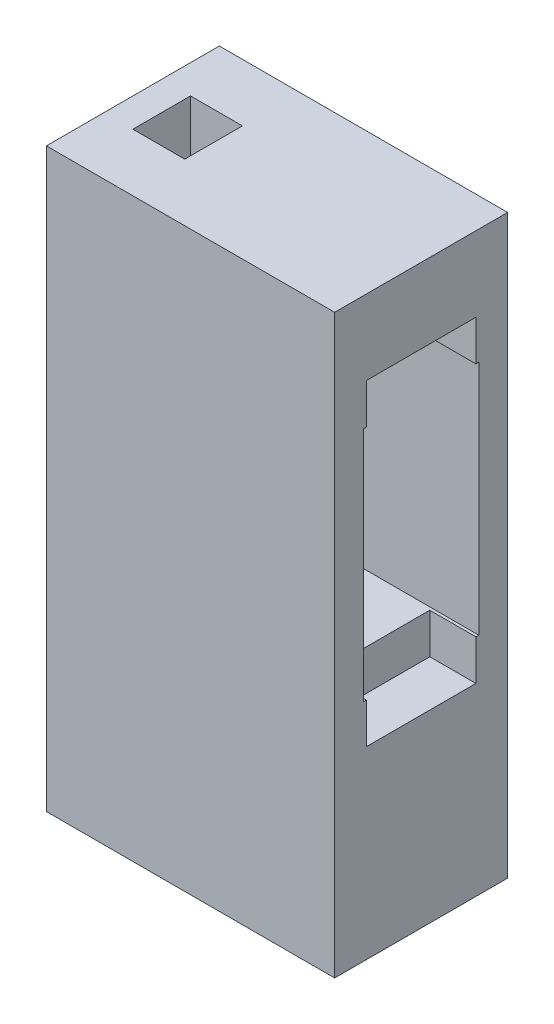
ISO-10303-21;
HEADER;
FILE_DESCRIPTION(('STEP AP214'),'2;1');
FILE_NAME('part.step','',(''),(''),'','','');
FILE_SCHEMA(('AUTOMOTIVE_DESIGN { 1 0 10303 214 1 1 1 1 }'));
ENDSEC;
DATA;
#1=APPLICATION_CONTEXT('core data for automotive mechanical design processes');
#2=APPLICATION_PROTOCOL_DEFINITION('international standard','automotive_design',2000,#1);
#3=PRODUCT_CONTEXT('',#1,'mechanical');
#4=PRODUCT('Part','Part','',(#3));
#5=PRODUCT_RELATED_PRODUCT_CATEGORY('part','',(#4));
#6=PRODUCT_DEFINITION_FORMATION('','',#4);
#7=PRODUCT_DEFINITION_CONTEXT('part definition',#1,'design');
#8=PRODUCT_DEFINITION('design','',#6,#7);
#9=PRODUCT_DEFINITION_SHAPE('','',#8);
#10=(LENGTH_UNIT() NAMED_UNIT(*) SI_UNIT(.MILLI.,.METRE.));
#11=(NAMED_UNIT(*) PLANE_ANGLE_UNIT() SI_UNIT($,.RADIAN.));
#12=(NAMED_UNIT(*) SI_UNIT($,.STERADIAN.) SOLID_ANGLE_UNIT());
#13=UNCERTAINTY_MEASURE_WITH_UNIT(LENGTH_MEASURE(1.E-05),#10,'distance_accuracy_value','');
#14=(GEOMETRIC_REPRESENTATION_CONTEXT(3) GLOBAL_UNCERTAINTY_ASSIGNED_CONTEXT((#13)) GLOBAL_UNIT_ASSIGNED_CONTEXT((#10,
#11,#12)) REPRESENTATION_CONTEXT('',''));
#15=CARTESIAN_POINT('',(0.,0.,0.));
#16=DIRECTION('',(0.,0.,1.));
#17=DIRECTION('',(1.,0.,0.));
#18=AXIS2_PLACEMENT_3D('',#15,#16,#17);
#19=CARTESIAN_POINT('',(-3.99999999999996,0.,0.));
#20=DIRECTION('',(1.,0.,0.));
#21=DIRECTION('',(0.,0.,-1.));
#22=AXIS2_PLACEMENT_3D('',#19,#20,#21);
#23=PLANE('',#22);
#24=DIRECTION('',(0.,1.,0.));
#25=VECTOR('',#24,1.);
#26=CARTESIAN_POINT('',(-3.99999999999996,0.,-7.99999999999999));
#27=LINE('',#26,#25);
#28=CARTESIAN_POINT('',(-3.99999999999996,39.,-7.99999999999999));
#29=VERTEX_POINT('',#28);
#30=CARTESIAN_POINT('',(-3.99999999999996,80.,-7.99999999999999));
#31=VERTEX_POINT('',#30);
#32=EDGE_CURVE('E504',#29,#31,#27,.T.);
#33=ORIENTED_EDGE('',*,*,#32,.F.);
#34=DIRECTION('',(0.,0.,-1.));
#35=VECTOR('',#34,1.);
#36=CARTESIAN_POINT('',(-3.99999999999996,39.,7.));
#37=LINE('',#36,#35);
#38=CARTESIAN_POINT('',(-3.99999999999997,39.,-13.));
#39=VERTEX_POINT('',#38);
#40=EDGE_CURVE('E412',#29,#39,#37,.T.);
#41=ORIENTED_EDGE('',*,*,#40,.T.);
#42=DIRECTION('',(0.,1.,0.));
#43=VECTOR('',#42,1.);
#44=CARTESIAN_POINT('',(-3.99999999999997,80.,-13.));
#45=LINE('',#44,#43);
#46=CARTESIAN_POINT('',(-3.99999999999997,80.,-13.));
#47=VERTEX_POINT('',#46);
#48=EDGE_CURVE('E417',#39,#47,#45,.T.);
#49=ORIENTED_EDGE('',*,*,#48,.T.);
#50=DIRECTION('',(0.,0.,1.));
#51=VECTOR('',#50,1.);
#52=CARTESIAN_POINT('',(-3.99999999999996,80.,7.));
#53=LINE('',#52,#51);
#54=EDGE_CURVE('E422',#47,#31,#53,.T.);
#55=ORIENTED_EDGE('',*,*,#54,.T.);
#56=EDGE_LOOP('',(#33,#41,#49,#55));
#57=FACE_BOUND('',#56,.T.);
#58=ADVANCED_FACE('F38',(#57),#23,.T.);
#59=CARTESIAN_POINT('',(-3.99999999999996,80.,7.));
#60=DIRECTION('',(0.,1.,0.));
#61=DIRECTION('',(0.,0.,1.));
#62=AXIS2_PLACEMENT_3D('',#59,#60,#61);
#63=PLANE('',#62);
#64=DIRECTION('',(1.,0.,0.));
#65=VECTOR('',#64,1.);
#66=CARTESIAN_POINT('',(-3.99999999999996,80.,2.00000000000001));
#67=LINE('',#66,#65);
#68=CARTESIAN_POINT('',(-3.99999999999996,80.,2.00000000000001));
#69=VERTEX_POINT('',#68);
#70=CARTESIAN_POINT('',(-2.99999999999998,80.,2.00000000000001));
#71=VERTEX_POINT('',#70);
#72=EDGE_CURVE('E299',#69,#71,#67,.T.);
#73=ORIENTED_EDGE('',*,*,#72,.T.);
#74=DIRECTION('',(0.,0.,-1.));
#75=VECTOR('',#74,1.);
#76=CARTESIAN_POINT('',(-2.99999999999998,80.,7.));
#77=LINE('',#76,#75);
#78=CARTESIAN_POINT('',(-2.99999999999998,80.,0.500000000000022));
#79=VERTEX_POINT('',#78);
#80=EDGE_CURVE('E295',#71,#79,#77,.T.);
#81=ORIENTED_EDGE('',*,*,#80,.T.);
#82=DIRECTION('',(1.,0.,0.));
#83=VECTOR('',#82,1.);
#84=CARTESIAN_POINT('',(-3.99999999999997,80.,0.500000000000022));
#85=LINE('',#84,#83);
#86=CARTESIAN_POINT('',(25.,80.,0.500000000000011));
#87=VERTEX_POINT('',#86);
#88=EDGE_CURVE('E315',#79,#87,#85,.T.);
#89=ORIENTED_EDGE('',*,*,#88,.T.);
#90=DIRECTION('',(0.,0.,-1.));
#91=VECTOR('',#90,1.);
#92=CARTESIAN_POINT('',(25.,80.,6.50000000000001));
#93=LINE('',#92,#91);
#94=CARTESIAN_POINT('',(25.,80.,6.50000000000001));
#95=VERTEX_POINT('',#94);
#96=EDGE_CURVE('E333',#95,#87,#93,.T.);
#97=ORIENTED_EDGE('',*,*,#96,.F.);
#98=DIRECTION('',(1.,0.,0.));
#99=VECTOR('',#98,1.);
#100=CARTESIAN_POINT('',(25.,80.,6.50000000000001));
#101=LINE('',#100,#99);
#102=CARTESIAN_POINT('',(33.,80.,6.50000000000001));
#103=VERTEX_POINT('',#102);
#104=EDGE_CURVE('E346',#95,#103,#101,.T.);
#105=ORIENTED_EDGE('',*,*,#104,.T.);
#106=DIRECTION('',(0.,0.,1.));
#107=VECTOR('',#106,1.);
#108=CARTESIAN_POINT('',(33.,80.,6.99999999999998));
#109=LINE('',#108,#107);
#110=CARTESIAN_POINT('',(33.,80.,6.99999999999998));
#111=VERTEX_POINT('',#110);
#112=EDGE_CURVE('E438',#103,#111,#109,.T.);
#113=ORIENTED_EDGE('',*,*,#112,.T.);
#114=DIRECTION('',(1.,0.,0.));
#115=VECTOR('',#114,1.);
#116=CARTESIAN_POINT('',(-3.99999999999996,80.,7.));
#117=LINE('',#116,#115);
#118=CARTESIAN_POINT('',(-3.99999999999996,80.,7.));
#119=VERTEX_POINT('',#118);
#120=EDGE_CURVE('E442',#119,#111,#117,.T.);
#121=ORIENTED_EDGE('',*,*,#120,.F.);
#122=EDGE_CURVE('E421',#69,#119,#53,.T.);
#123=ORIENTED_EDGE('',*,*,#122,.F.);
#124=EDGE_LOOP('',(#73,#81,#89,#97,#105,#113,#121,#123));
#125=FACE_BOUND('',#124,.T.);
#126=ADVANCED_FACE('F530',(#125),#63,.F.);
#127=CARTESIAN_POINT('',(25.,0.,0.));
#128=DIRECTION('',(-1.,0.,0.));
#129=DIRECTION('',(0.,0.,1.));
#130=AXIS2_PLACEMENT_3D('',#127,#128,#129);
#131=PLANE('',#130);
#132=ORIENTED_EDGE('',*,*,#96,.T.);
#133=DIRECTION('',(0.,-1.,0.));
#134=VECTOR('',#133,1.);
#135=CARTESIAN_POINT('',(25.,80.,0.500000000000011));
#136=LINE('',#135,#134);
#137=CARTESIAN_POINT('',(25.,87.,0.500000000000011));
#138=VERTEX_POINT('',#137);
#139=EDGE_CURVE('E307',#138,#87,#136,.T.);
#140=ORIENTED_EDGE('',*,*,#139,.F.);
#141=DIRECTION('',(0.,0.,1.));
#142=VECTOR('',#141,1.);
#143=CARTESIAN_POINT('',(25.,87.,6.50000000000001));
#144=LINE('',#143,#142);
#145=CARTESIAN_POINT('',(25.,87.,6.50000000000001));
#146=VERTEX_POINT('',#145);
#147=EDGE_CURVE('E341',#138,#146,#144,.T.);
#148=ORIENTED_EDGE('',*,*,#147,.T.);
#149=DIRECTION('',(0.,-1.,0.));
#150=VECTOR('',#149,1.);
#151=CARTESIAN_POINT('',(25.,80.,6.50000000000001));
#152=LINE('',#151,#150);
#153=EDGE_CURVE('E328',#146,#95,#152,.T.);
#154=ORIENTED_EDGE('',*,*,#153,.T.);
#155=EDGE_LOOP('',(#132,#140,#148,#154));
#156=FACE_BOUND('',#155,.T.);
#157=ADVANCED_FACE('F539',(#156),#131,.F.);
#158=CARTESIAN_POINT('',(-17.,100.,-18.));
#159=DIRECTION('',(1.,0.,0.));
#160=DIRECTION('',(0.,0.,-1.));
#161=AXIS2_PLACEMENT_3D('',#158,#159,#160);
#162=PLANE('',#161);
#163=CARTESIAN_POINT('',(-17.,71.,-2.03845671726555));
#164=DIRECTION('',(-1.,0.,0.));
#165=DIRECTION('',(0.,0.,1.));
#166=AXIS2_PLACEMENT_3D('',#163,#164,#165);
#167=CIRCLE('',#166,3.);
#168=CARTESIAN_POINT('',(-17.,71.,0.961543282734456));
#169=VERTEX_POINT('',#168);
#170=EDGE_CURVE('E654',#169,#169,#167,.T.);
#171=ORIENTED_EDGE('',*,*,#170,.F.);
#172=EDGE_LOOP('',(#171));
#173=FACE_BOUND('',#172,.T.);
#174=DIRECTION('',(0.,0.,1.));
#175=VECTOR('',#174,1.);
#176=CARTESIAN_POINT('',(-17.,39.,-7.99999999999999));
#177=LINE('',#176,#175);
#178=CARTESIAN_POINT('',(-17.,39.,-7.99999999999999));
#179=VERTEX_POINT('',#178);
#180=CARTESIAN_POINT('',(-17.,39.,2.00000000000001));
#181=VERTEX_POINT('',#180);
#182=EDGE_CURVE('E236',#179,#181,#177,.T.);
#183=ORIENTED_EDGE('',*,*,#182,.F.);
#184=DIRECTION('',(0.,-1.,0.));
#185=VECTOR('',#184,1.);
#186=CARTESIAN_POINT('',(-17.,39.,-7.99999999999999));
#187=LINE('',#186,#185);
#188=CARTESIAN_POINT('',(-17.,49.,-7.99999999999999));
#189=VERTEX_POINT('',#188);
#190=EDGE_CURVE('E243',#189,#179,#187,.T.);
#191=ORIENTED_EDGE('',*,*,#190,.F.);
#192=DIRECTION('',(0.,0.,-1.));
#193=VECTOR('',#192,1.);
#194=CARTESIAN_POINT('',(-17.,49.,-7.99999999999999));
#195=LINE('',#194,#193);
#196=CARTESIAN_POINT('',(-17.,49.,2.00000000000001));
#197=VERTEX_POINT('',#196);
#198=EDGE_CURVE('E247',#197,#189,#195,.T.);
#199=ORIENTED_EDGE('',*,*,#198,.F.);
#200=DIRECTION('',(0.,1.,0.));
#201=VECTOR('',#200,1.);
#202=CARTESIAN_POINT('',(-17.,39.,2.00000000000001));
#203=LINE('',#202,#201);
#204=EDGE_CURVE('E224',#181,#197,#203,.T.);
#205=ORIENTED_EDGE('',*,*,#204,.F.);
#206=EDGE_LOOP('',(#183,#191,#199,#205));
#207=FACE_BOUND('',#206,.T.);
#208=DIRECTION('',(0.,0.,1.));
#209=VECTOR('',#208,1.);
#210=CARTESIAN_POINT('',(-17.,0.,-18.));
#211=LINE('',#210,#209);
#212=CARTESIAN_POINT('',(-17.,0.,-18.));
#213=VERTEX_POINT('',#212);
#214=CARTESIAN_POINT('',(-17.,0.,12.));
#215=VERTEX_POINT('',#214);
#216=EDGE_CURVE('E446',#213,#215,#211,.T.);
#217=ORIENTED_EDGE('',*,*,#216,.T.);
#218=DIRECTION('',(0.,-1.,0.));
#219=VECTOR('',#218,1.);
#220=CARTESIAN_POINT('',(-17.,100.,12.));
#221=LINE('',#220,#219);
#222=CARTESIAN_POINT('',(-17.,100.,12.));
#223=VERTEX_POINT('',#222);
#224=EDGE_CURVE('E494',#223,#215,#221,.T.);
#225=ORIENTED_EDGE('',*,*,#224,.F.);
#226=DIRECTION('',(0.,0.,1.));
#227=VECTOR('',#226,1.);
#228=CARTESIAN_POINT('',(-17.,100.,-18.));
#229=LINE('',#228,#227);
#230=CARTESIAN_POINT('',(-17.,100.,-18.));
#231=VERTEX_POINT('',#230);
#232=EDGE_CURVE('E457',#231,#223,#229,.T.);
#233=ORIENTED_EDGE('',*,*,#232,.F.);
#234=DIRECTION('',(0.,-1.,0.));
#235=VECTOR('',#234,1.);
#236=CARTESIAN_POINT('',(-17.,100.,-18.));
#237=LINE('',#236,#235);
#238=EDGE_CURVE('E471',#231,#213,#237,.T.);
#239=ORIENTED_EDGE('',*,*,#238,.T.);
#240=EDGE_LOOP('',(#217,#225,#233,#239));
#241=FACE_BOUND('',#240,.T.);
#242=ADVANCED_FACE('F245',(#173,#207,#241),#162,.F.);
#243=CARTESIAN_POINT('',(-17.,100.,12.));
#244=DIRECTION('',(0.,0.,-1.));
#245=DIRECTION('',(-1.,0.,0.));
#246=AXIS2_PLACEMENT_3D('',#243,#244,#245);
#247=PLANE('',#246);
#248=DIRECTION('',(1.,0.,0.));
#249=VECTOR('',#248,1.);
#250=CARTESIAN_POINT('',(-17.,0.,12.));
#251=LINE('',#250,#249);
#252=CARTESIAN_POINT('',(33.,0.,12.));
#253=VERTEX_POINT('',#252);
#254=EDGE_CURVE('E475',#215,#253,#251,.T.);
#255=ORIENTED_EDGE('',*,*,#254,.T.);
#256=DIRECTION('',(0.,-1.,0.));
#257=VECTOR('',#256,1.);
#258=CARTESIAN_POINT('',(33.,100.,12.));
#259=LINE('',#258,#257);
#260=CARTESIAN_POINT('',(33.,100.,12.));
#261=VERTEX_POINT('',#260);
#262=EDGE_CURVE('E490',#261,#253,#259,.T.);
#263=ORIENTED_EDGE('',*,*,#262,.F.);
#264=DIRECTION('',(1.,0.,0.));
#265=VECTOR('',#264,1.);
#266=CARTESIAN_POINT('',(-17.,100.,12.));
#267=LINE('',#266,#265);
#268=EDGE_CURVE('E461',#223,#261,#267,.T.);
#269=ORIENTED_EDGE('',*,*,#268,.F.);
#270=ORIENTED_EDGE('',*,*,#224,.T.);
#271=EDGE_LOOP('',(#255,#263,#269,#270));
#272=FACE_BOUND('',#271,.T.);
#273=ADVANCED_FACE('F645',(#272),#247,.F.);
#274=CARTESIAN_POINT('',(33.,100.,-18.));
#275=DIRECTION('',(-1.,0.,0.));
#276=DIRECTION('',(0.,0.,1.));
#277=AXIS2_PLACEMENT_3D('',#274,#275,#276);
#278=PLANE('',#277);
#279=ORIENTED_EDGE('',*,*,#112,.F.);
#280=DIRECTION('',(0.,-1.,0.));
#281=VECTOR('',#280,1.);
#282=CARTESIAN_POINT('',(33.,80.,6.50000000000001));
#283=LINE('',#282,#281);
#284=CARTESIAN_POINT('',(33.,87.,6.50000000000001));
#285=VERTEX_POINT('',#284);
#286=EDGE_CURVE('E347',#285,#103,#283,.T.);
#287=ORIENTED_EDGE('',*,*,#286,.F.);
#288=DIRECTION('',(0.,0.,1.));
#289=VECTOR('',#288,1.);
#290=CARTESIAN_POINT('',(33.,87.,6.50000000000001));
#291=LINE('',#290,#289);
#292=CARTESIAN_POINT('',(33.,87.,-12.5));
#293=VERTEX_POINT('',#292);
#294=EDGE_CURVE('E332',#293,#285,#291,.T.);
#295=ORIENTED_EDGE('',*,*,#294,.F.);
#296=DIRECTION('',(0.,1.,0.));
#297=VECTOR('',#296,1.);
#298=CARTESIAN_POINT('',(33.,80.,-12.5));
#299=LINE('',#298,#297);
#300=CARTESIAN_POINT('',(33.,80.,-12.5));
#301=VERTEX_POINT('',#300);
#302=EDGE_CURVE('E350',#301,#293,#299,.T.);
#303=ORIENTED_EDGE('',*,*,#302,.F.);
#304=CARTESIAN_POINT('',(33.,80.,-13.));
#305=VERTEX_POINT('',#304);
#306=EDGE_CURVE('E413',#305,#301,#109,.T.);
#307=ORIENTED_EDGE('',*,*,#306,.F.);
#308=DIRECTION('',(0.,1.,0.));
#309=VECTOR('',#308,1.);
#310=CARTESIAN_POINT('',(33.,80.,-13.));
#311=LINE('',#310,#309);
#312=CARTESIAN_POINT('',(33.,39.,-13.));
#313=VERTEX_POINT('',#312);
#314=EDGE_CURVE('E434',#313,#305,#311,.T.);
#315=ORIENTED_EDGE('',*,*,#314,.F.);
#316=DIRECTION('',(0.,0.,-1.));
#317=VECTOR('',#316,1.);
#318=CARTESIAN_POINT('',(33.,39.,6.99999999999998));
#319=LINE('',#318,#317);
#320=CARTESIAN_POINT('',(33.,39.,-12.5));
#321=VERTEX_POINT('',#320);
#322=EDGE_CURVE('E429',#321,#313,#319,.T.);
#323=ORIENTED_EDGE('',*,*,#322,.F.);
#324=DIRECTION('',(0.,1.,0.));
#325=VECTOR('',#324,1.);
#326=CARTESIAN_POINT('',(33.,39.,-12.5));
#327=LINE('',#326,#325);
#328=CARTESIAN_POINT('',(33.,32.,-12.5));
#329=VERTEX_POINT('',#328);
#330=EDGE_CURVE('E376',#329,#321,#327,.T.);
#331=ORIENTED_EDGE('',*,*,#330,.F.);
#332=DIRECTION('',(0.,0.,-1.));
#333=VECTOR('',#332,1.);
#334=CARTESIAN_POINT('',(33.,32.,6.50000000000001));
#335=LINE('',#334,#333);
#336=CARTESIAN_POINT('',(33.,32.,6.50000000000001));
#337=VERTEX_POINT('',#336);
#338=EDGE_CURVE('E391',#337,#329,#335,.T.);
#339=ORIENTED_EDGE('',*,*,#338,.F.);
#340=DIRECTION('',(0.,-1.,0.));
#341=VECTOR('',#340,1.);
#342=CARTESIAN_POINT('',(33.,39.,6.50000000000001));
#343=LINE('',#342,#341);
#344=CARTESIAN_POINT('',(33.,39.,6.50000000000001));
#345=VERTEX_POINT('',#344);
#346=EDGE_CURVE('E319',#345,#337,#343,.T.);
#347=ORIENTED_EDGE('',*,*,#346,.F.);
#348=CARTESIAN_POINT('',(33.,39.,7.));
#349=VERTEX_POINT('',#348);
#350=EDGE_CURVE('E430',#349,#345,#319,.T.);
#351=ORIENTED_EDGE('',*,*,#350,.F.);
#352=DIRECTION('',(0.,-1.,0.));
#353=VECTOR('',#352,1.);
#354=CARTESIAN_POINT('',(33.,80.,6.99999999999998));
#355=LINE('',#354,#353);
#356=EDGE_CURVE('E361',#111,#349,#355,.T.);
#357=ORIENTED_EDGE('',*,*,#356,.F.);
#358=EDGE_LOOP('',(#279,#287,#295,#303,#307,#315,#323,#331,#339,#347,#351,#357));
#359=FACE_BOUND('',#358,.T.);
#360=DIRECTION('',(0.,0.,-1.));
#361=VECTOR('',#360,1.);
#362=CARTESIAN_POINT('',(33.,0.,-18.));
#363=LINE('',#362,#361);
#364=CARTESIAN_POINT('',(33.,0.,-18.));
#365=VERTEX_POINT('',#364);
#366=EDGE_CURVE('E478',#253,#365,#363,.T.);
#367=ORIENTED_EDGE('',*,*,#366,.T.);
#368=DIRECTION('',(0.,-1.,0.));
#369=VECTOR('',#368,1.);
#370=CARTESIAN_POINT('',(33.,100.,-18.));
#371=LINE('',#370,#369);
#372=CARTESIAN_POINT('',(33.,100.,-18.));
#373=VERTEX_POINT('',#372);
#374=EDGE_CURVE('E486',#373,#365,#371,.T.);
#375=ORIENTED_EDGE('',*,*,#374,.F.);
#376=DIRECTION('',(0.,0.,-1.));
#377=VECTOR('',#376,1.);
#378=CARTESIAN_POINT('',(33.,100.,-18.));
#379=LINE('',#378,#377);
#380=EDGE_CURVE('E465',#261,#373,#379,.T.);
#381=ORIENTED_EDGE('',*,*,#380,.F.);
#382=ORIENTED_EDGE('',*,*,#262,.T.);
#383=EDGE_LOOP('',(#367,#375,#381,#382));
#384=FACE_BOUND('',#383,.T.);
#385=ADVANCED_FACE('F548',(#359,#384),#278,.F.);
#386=CARTESIAN_POINT('',(-17.,100.,-18.));
#387=DIRECTION('',(0.,0.,1.));
#388=DIRECTION('',(1.,0.,0.));
#389=AXIS2_PLACEMENT_3D('',#386,#387,#388);
#390=PLANE('',#389);
#391=DIRECTION('',(-1.,0.,0.));
#392=VECTOR('',#391,1.);
#393=CARTESIAN_POINT('',(-17.,0.,-18.));
#394=LINE('',#393,#392);
#395=EDGE_CURVE('E462',#365,#213,#394,.T.);
#396=ORIENTED_EDGE('',*,*,#395,.T.);
#397=ORIENTED_EDGE('',*,*,#238,.F.);
#398=DIRECTION('',(-1.,0.,0.));
#399=VECTOR('',#398,1.);
#400=CARTESIAN_POINT('',(-17.,100.,-18.));
#401=LINE('',#400,#399);
#402=EDGE_CURVE('E468',#373,#231,#401,.T.);
#403=ORIENTED_EDGE('',*,*,#402,.F.);
#404=ORIENTED_EDGE('',*,*,#374,.T.);
#405=EDGE_LOOP('',(#396,#397,#403,#404));
#406=FACE_BOUND('',#405,.T.);
#407=ADVANCED_FACE('F638',(#406),#390,.F.);
#408=CARTESIAN_POINT('',(0.,100.,0.));
#409=DIRECTION('',(0.,1.,0.));
#410=DIRECTION('',(0.,0.,1.));
#411=AXIS2_PLACEMENT_3D('',#408,#409,#410);
#412=PLANE('',#411);
#413=DIRECTION('',(0.,0.,1.));
#414=VECTOR('',#413,1.);
#415=CARTESIAN_POINT('',(-12.,100.,-7.99999999999999));
#416=LINE('',#415,#414);
#417=CARTESIAN_POINT('',(-12.,100.,-7.99999999999999));
#418=VERTEX_POINT('',#417);
#419=CARTESIAN_POINT('',(-12.,100.,2.00000000000001));
#420=VERTEX_POINT('',#419);
#421=EDGE_CURVE('E251',#418,#420,#416,.T.);
#422=ORIENTED_EDGE('',*,*,#421,.F.);
#423=DIRECTION('',(-1.,0.,0.));
#424=VECTOR('',#423,1.);
#425=CARTESIAN_POINT('',(-12.,100.,-7.99999999999999));
#426=LINE('',#425,#424);
#427=CARTESIAN_POINT('',(-2.99999999999998,100.,-7.99999999999999));
#428=VERTEX_POINT('',#427);
#429=EDGE_CURVE('E233',#428,#418,#426,.T.);
#430=ORIENTED_EDGE('',*,*,#429,.F.);
#431=DIRECTION('',(0.,0.,-1.));
#432=VECTOR('',#431,1.);
#433=CARTESIAN_POINT('',(-2.99999999999998,100.,-7.99999999999999));
#434=LINE('',#433,#432);
#435=CARTESIAN_POINT('',(-2.99999999999998,100.,2.00000000000001));
#436=VERTEX_POINT('',#435);
#437=EDGE_CURVE('E265',#436,#428,#434,.T.);
#438=ORIENTED_EDGE('',*,*,#437,.F.);
#439=DIRECTION('',(1.,0.,0.));
#440=VECTOR('',#439,1.);
#441=CARTESIAN_POINT('',(-12.,100.,2.00000000000001));
#442=LINE('',#441,#440);
#443=EDGE_CURVE('E261',#420,#436,#442,.T.);
#444=ORIENTED_EDGE('',*,*,#443,.F.);
#445=EDGE_LOOP('',(#422,#430,#438,#444));
#446=FACE_BOUND('',#445,.T.);
#447=ORIENTED_EDGE('',*,*,#232,.T.);
#448=ORIENTED_EDGE('',*,*,#268,.T.);
#449=ORIENTED_EDGE('',*,*,#380,.T.);
#450=ORIENTED_EDGE('',*,*,#402,.T.);
#451=EDGE_LOOP('',(#447,#448,#449,#450));
#452=FACE_BOUND('',#451,.T.);
#453=ADVANCED_FACE('F523',(#446,#452),#412,.T.);
#454=CARTESIAN_POINT('',(0.,0.,0.));
#455=DIRECTION('',(0.,1.,0.));
#456=DIRECTION('',(0.,0.,1.));
#457=AXIS2_PLACEMENT_3D('',#454,#455,#456);
#458=PLANE('',#457);
#459=ORIENTED_EDGE('',*,*,#216,.F.);
#460=ORIENTED_EDGE('',*,*,#395,.F.);
#461=ORIENTED_EDGE('',*,*,#366,.F.);
#462=ORIENTED_EDGE('',*,*,#254,.F.);
#463=EDGE_LOOP('',(#459,#460,#461,#462));
#464=FACE_BOUND('',#463,.T.);
#465=ADVANCED_FACE('F629',(#464),#458,.F.);
#466=CARTESIAN_POINT('',(-3.99999999999996,80.,7.));
#467=DIRECTION('',(0.,0.,1.));
#468=DIRECTION('',(1.,0.,0.));
#469=AXIS2_PLACEMENT_3D('',#466,#467,#468);
#470=PLANE('',#469);
#471=ORIENTED_EDGE('',*,*,#356,.T.);
#472=DIRECTION('',(1.,0.,0.));
#473=VECTOR('',#472,1.);
#474=CARTESIAN_POINT('',(-3.99999999999996,39.,7.));
#475=LINE('',#474,#473);
#476=CARTESIAN_POINT('',(-3.99999999999996,39.,7.));
#477=VERTEX_POINT('',#476);
#478=EDGE_CURVE('E426',#477,#349,#475,.T.);
#479=ORIENTED_EDGE('',*,*,#478,.F.);
#480=DIRECTION('',(0.,-1.,0.));
#481=VECTOR('',#480,1.);
#482=CARTESIAN_POINT('',(-3.99999999999996,80.,7.));
#483=LINE('',#482,#481);
#484=EDGE_CURVE('E408',#119,#477,#483,.T.);
#485=ORIENTED_EDGE('',*,*,#484,.F.);
#486=ORIENTED_EDGE('',*,*,#120,.T.);
#487=EDGE_LOOP('',(#471,#479,#485,#486));
#488=FACE_BOUND('',#487,.T.);
#489=ADVANCED_FACE('F601',(#488),#470,.F.);
#490=DIRECTION('',(0.,0.,-1.));
#491=VECTOR('',#490,1.);
#492=CARTESIAN_POINT('',(-2.99999999999998,80.,7.));
#493=LINE('',#492,#491);
#494=CARTESIAN_POINT('',(-2.99999999999998,80.,-6.49999999999998));
#495=VERTEX_POINT('',#494);
#496=CARTESIAN_POINT('',(-2.99999999999998,80.,-7.99999999999999));
#497=VERTEX_POINT('',#496);
#498=EDGE_CURVE('E287',#495,#497,#493,.T.);
#499=ORIENTED_EDGE('',*,*,#498,.T.);
#500=DIRECTION('',(-1.,0.,0.));
#501=VECTOR('',#500,1.);
#502=CARTESIAN_POINT('',(-3.99999999999996,80.,-7.99999999999999));
#503=LINE('',#502,#501);
#504=EDGE_CURVE('E303',#497,#31,#503,.T.);
#505=ORIENTED_EDGE('',*,*,#504,.T.);
#506=ORIENTED_EDGE('',*,*,#54,.F.);
#507=DIRECTION('',(1.,0.,0.));
#508=VECTOR('',#507,1.);
#509=CARTESIAN_POINT('',(-3.99999999999997,80.,-13.));
#510=LINE('',#509,#508);
#511=EDGE_CURVE('E447',#47,#305,#510,.T.);
#512=ORIENTED_EDGE('',*,*,#511,.T.);
#513=ORIENTED_EDGE('',*,*,#306,.T.);
#514=DIRECTION('',(1.,0.,0.));
#515=VECTOR('',#514,1.);
#516=CARTESIAN_POINT('',(25.,80.,-12.5));
#517=LINE('',#516,#515);
#518=CARTESIAN_POINT('',(25.,80.,-12.5));
#519=VERTEX_POINT('',#518);
#520=EDGE_CURVE('E365',#519,#301,#517,.T.);
#521=ORIENTED_EDGE('',*,*,#520,.F.);
#522=CARTESIAN_POINT('',(25.,80.,-6.49999999999999));
#523=VERTEX_POINT('',#522);
#524=EDGE_CURVE('E331',#523,#519,#93,.T.);
#525=ORIENTED_EDGE('',*,*,#524,.F.);
#526=DIRECTION('',(1.,0.,0.));
#527=VECTOR('',#526,1.);
#528=CARTESIAN_POINT('',(-3.99999999999997,80.,-6.49999999999998));
#529=LINE('',#528,#527);
#530=EDGE_CURVE('E323',#495,#523,#529,.T.);
#531=ORIENTED_EDGE('',*,*,#530,.F.);
#532=EDGE_LOOP('',(#499,#505,#506,#512,#513,#521,#525,#531));
#533=FACE_BOUND('',#532,.T.);
#534=ADVANCED_FACE('F568',(#533),#63,.F.);
#535=CARTESIAN_POINT('',(-3.99999999999997,80.,-13.));
#536=DIRECTION('',(0.,0.,-1.));
#537=DIRECTION('',(-1.,0.,0.));
#538=AXIS2_PLACEMENT_3D('',#535,#536,#537);
#539=PLANE('',#538);
#540=ORIENTED_EDGE('',*,*,#314,.T.);
#541=ORIENTED_EDGE('',*,*,#511,.F.);
#542=ORIENTED_EDGE('',*,*,#48,.F.);
#543=DIRECTION('',(1.,0.,0.));
#544=VECTOR('',#543,1.);
#545=CARTESIAN_POINT('',(-3.99999999999997,39.,-13.));
#546=LINE('',#545,#544);
#547=EDGE_CURVE('E450',#39,#313,#546,.T.);
#548=ORIENTED_EDGE('',*,*,#547,.T.);
#549=EDGE_LOOP('',(#540,#541,#542,#548));
#550=FACE_BOUND('',#549,.T.);
#551=ADVANCED_FACE('F584',(#550),#539,.F.);
#552=CARTESIAN_POINT('',(-3.99999999999996,39.,7.));
#553=DIRECTION('',(0.,-1.,0.));
#554=DIRECTION('',(0.,0.,-1.));
#555=AXIS2_PLACEMENT_3D('',#552,#553,#554);
#556=PLANE('',#555);
#557=ORIENTED_EDGE('',*,*,#40,.F.);
#558=DIRECTION('',(-1.,0.,0.));
#559=VECTOR('',#558,1.);
#560=CARTESIAN_POINT('',(-12.,39.,-7.99999999999999));
#561=LINE('',#560,#559);
#562=EDGE_CURVE('E232',#29,#179,#561,.T.);
#563=ORIENTED_EDGE('',*,*,#562,.T.);
#564=ORIENTED_EDGE('',*,*,#182,.T.);
#565=DIRECTION('',(1.,0.,0.));
#566=VECTOR('',#565,1.);
#567=CARTESIAN_POINT('',(-12.,39.,2.00000000000001));
#568=LINE('',#567,#566);
#569=CARTESIAN_POINT('',(-3.99999999999996,39.,2.00000000000001));
#570=VERTEX_POINT('',#569);
#571=EDGE_CURVE('E220',#181,#570,#568,.T.);
#572=ORIENTED_EDGE('',*,*,#571,.T.);
#573=EDGE_CURVE('E414',#477,#570,#37,.T.);
#574=ORIENTED_EDGE('',*,*,#573,.F.);
#575=ORIENTED_EDGE('',*,*,#478,.T.);
#576=ORIENTED_EDGE('',*,*,#350,.T.);
#577=DIRECTION('',(1.,0.,0.));
#578=VECTOR('',#577,1.);
#579=CARTESIAN_POINT('',(25.,39.,6.50000000000001));
#580=LINE('',#579,#578);
#581=CARTESIAN_POINT('',(25.,39.,6.50000000000001));
#582=VERTEX_POINT('',#581);
#583=EDGE_CURVE('E351',#582,#345,#580,.T.);
#584=ORIENTED_EDGE('',*,*,#583,.F.);
#585=DIRECTION('',(0.,0.,1.));
#586=VECTOR('',#585,1.);
#587=CARTESIAN_POINT('',(25.,39.,6.50000000000001));
#588=LINE('',#587,#586);
#589=CARTESIAN_POINT('',(25.,39.,-12.5));
#590=VERTEX_POINT('',#589);
#591=EDGE_CURVE('E383',#590,#582,#588,.T.);
#592=ORIENTED_EDGE('',*,*,#591,.F.);
#593=DIRECTION('',(1.,0.,0.));
#594=VECTOR('',#593,1.);
#595=CARTESIAN_POINT('',(25.,39.,-12.5));
#596=LINE('',#595,#594);
#597=EDGE_CURVE('E399',#590,#321,#596,.T.);
#598=ORIENTED_EDGE('',*,*,#597,.T.);
#599=ORIENTED_EDGE('',*,*,#322,.T.);
#600=ORIENTED_EDGE('',*,*,#547,.F.);
#601=EDGE_LOOP('',(#557,#563,#564,#572,#574,#575,#576,#584,#592,#598,#599,#600));
#602=FACE_BOUND('',#601,.T.);
#603=ADVANCED_FACE('F238',(#602),#556,.F.);
#604=DIRECTION('',(0.,-1.,0.));
#605=VECTOR('',#604,1.);
#606=CARTESIAN_POINT('',(-3.99999999999996,0.,2.00000000000001));
#607=LINE('',#606,#605);
#608=EDGE_CURVE('E227',#69,#570,#607,.T.);
#609=ORIENTED_EDGE('',*,*,#608,.F.);
#610=ORIENTED_EDGE('',*,*,#122,.T.);
#611=ORIENTED_EDGE('',*,*,#484,.T.);
#612=ORIENTED_EDGE('',*,*,#573,.T.);
#613=EDGE_LOOP('',(#609,#610,#611,#612));
#614=FACE_BOUND('',#613,.T.);
#615=ADVANCED_FACE('F605',(#614),#23,.T.);
#616=CARTESIAN_POINT('',(25.,39.,6.50000000000001));
#617=DIRECTION('',(0.,0.,1.));
#618=DIRECTION('',(1.,0.,0.));
#619=AXIS2_PLACEMENT_3D('',#616,#617,#618);
#620=PLANE('',#619);
#621=ORIENTED_EDGE('',*,*,#346,.T.);
#622=DIRECTION('',(1.,0.,0.));
#623=VECTOR('',#622,1.);
#624=CARTESIAN_POINT('',(25.,32.,6.50000000000001));
#625=LINE('',#624,#623);
#626=CARTESIAN_POINT('',(25.,32.,6.50000000000001));
#627=VERTEX_POINT('',#626);
#628=EDGE_CURVE('E387',#627,#337,#625,.T.);
#629=ORIENTED_EDGE('',*,*,#628,.F.);
#630=DIRECTION('',(0.,-1.,0.));
#631=VECTOR('',#630,1.);
#632=CARTESIAN_POINT('',(25.,39.,6.50000000000001));
#633=LINE('',#632,#631);
#634=EDGE_CURVE('E371',#582,#627,#633,.T.);
#635=ORIENTED_EDGE('',*,*,#634,.F.);
#636=ORIENTED_EDGE('',*,*,#583,.T.);
#637=EDGE_LOOP('',(#621,#629,#635,#636));
#638=FACE_BOUND('',#637,.T.);
#639=ADVANCED_FACE('F597',(#638),#620,.F.);
#640=CARTESIAN_POINT('',(25.,39.,-12.5));
#641=DIRECTION('',(0.,0.,-1.));
#642=DIRECTION('',(0.,1.,0.));
#643=AXIS2_PLACEMENT_3D('',#640,#641,#642);
#644=PLANE('',#643);
#645=ORIENTED_EDGE('',*,*,#330,.T.);
#646=ORIENTED_EDGE('',*,*,#597,.F.);
#647=DIRECTION('',(0.,1.,0.));
#648=VECTOR('',#647,1.);
#649=CARTESIAN_POINT('',(25.,39.,-12.5));
#650=LINE('',#649,#648);
#651=CARTESIAN_POINT('',(25.,32.,-12.5));
#652=VERTEX_POINT('',#651);
#653=EDGE_CURVE('E380',#652,#590,#650,.T.);
#654=ORIENTED_EDGE('',*,*,#653,.F.);
#655=DIRECTION('',(1.,0.,0.));
#656=VECTOR('',#655,1.);
#657=CARTESIAN_POINT('',(25.,32.,-12.5));
#658=LINE('',#657,#656);
#659=EDGE_CURVE('E403',#652,#329,#658,.T.);
#660=ORIENTED_EDGE('',*,*,#659,.T.);
#661=EDGE_LOOP('',(#645,#646,#654,#660));
#662=FACE_BOUND('',#661,.T.);
#663=ADVANCED_FACE('F591',(#662),#644,.F.);
#664=CARTESIAN_POINT('',(25.,32.,6.50000000000001));
#665=DIRECTION('',(0.,-1.,0.));
#666=DIRECTION('',(0.,0.,-1.));
#667=AXIS2_PLACEMENT_3D('',#664,#665,#666);
#668=PLANE('',#667);
#669=ORIENTED_EDGE('',*,*,#338,.T.);
#670=ORIENTED_EDGE('',*,*,#659,.F.);
#671=DIRECTION('',(0.,0.,-1.));
#672=VECTOR('',#671,1.);
#673=CARTESIAN_POINT('',(25.,32.,6.50000000000001));
#674=LINE('',#673,#672);
#675=EDGE_CURVE('E375',#627,#652,#674,.T.);
#676=ORIENTED_EDGE('',*,*,#675,.F.);
#677=ORIENTED_EDGE('',*,*,#628,.T.);
#678=EDGE_LOOP('',(#669,#670,#676,#677));
#679=FACE_BOUND('',#678,.T.);
#680=ADVANCED_FACE('F595',(#679),#668,.F.);
#681=CARTESIAN_POINT('',(25.,0.,0.));
#682=DIRECTION('',(1.,0.,0.));
#683=DIRECTION('',(0.,0.,-1.));
#684=AXIS2_PLACEMENT_3D('',#681,#682,#683);
#685=PLANE('',#684);
#686=ORIENTED_EDGE('',*,*,#634,.T.);
#687=ORIENTED_EDGE('',*,*,#675,.T.);
#688=ORIENTED_EDGE('',*,*,#653,.T.);
#689=ORIENTED_EDGE('',*,*,#591,.T.);
#690=EDGE_LOOP('',(#686,#687,#688,#689));
#691=FACE_BOUND('',#690,.T.);
#692=ADVANCED_FACE('F691',(#691),#685,.T.);
#693=CARTESIAN_POINT('',(25.,80.,6.50000000000001));
#694=DIRECTION('',(0.,0.,1.));
#695=DIRECTION('',(1.,0.,0.));
#696=AXIS2_PLACEMENT_3D('',#693,#694,#695);
#697=PLANE('',#696);
#698=ORIENTED_EDGE('',*,*,#286,.T.);
#699=ORIENTED_EDGE('',*,*,#104,.F.);
#700=ORIENTED_EDGE('',*,*,#153,.F.);
#701=DIRECTION('',(1.,0.,0.));
#702=VECTOR('',#701,1.);
#703=CARTESIAN_POINT('',(25.,87.,6.50000000000001));
#704=LINE('',#703,#702);
#705=EDGE_CURVE('E358',#146,#285,#704,.T.);
#706=ORIENTED_EDGE('',*,*,#705,.T.);
#707=EDGE_LOOP('',(#698,#699,#700,#706));
#708=FACE_BOUND('',#707,.T.);
#709=ADVANCED_FACE('F686',(#708),#697,.F.);
#710=CARTESIAN_POINT('',(25.,87.,6.50000000000001));
#711=DIRECTION('',(0.,1.,0.));
#712=DIRECTION('',(0.,0.,1.));
#713=AXIS2_PLACEMENT_3D('',#710,#711,#712);
#714=PLANE('',#713);
#715=DIRECTION('',(1.,0.,0.));
#716=VECTOR('',#715,1.);
#717=CARTESIAN_POINT('',(-3.99999999999997,87.,0.500000000000022));
#718=LINE('',#717,#716);
#719=CARTESIAN_POINT('',(-2.99999999999997,87.,0.500000000000017));
#720=VERTEX_POINT('',#719);
#721=EDGE_CURVE('E316',#720,#138,#718,.T.);
#722=ORIENTED_EDGE('',*,*,#721,.F.);
#723=DIRECTION('',(0.,0.,-1.));
#724=VECTOR('',#723,1.);
#725=CARTESIAN_POINT('',(-2.99999999999997,87.,6.50000000000001));
#726=LINE('',#725,#724);
#727=CARTESIAN_POINT('',(-2.99999999999998,87.,-6.49999999999998));
#728=VERTEX_POINT('',#727);
#729=EDGE_CURVE('E275',#720,#728,#726,.T.);
#730=ORIENTED_EDGE('',*,*,#729,.T.);
#731=DIRECTION('',(1.,0.,0.));
#732=VECTOR('',#731,1.);
#733=CARTESIAN_POINT('',(-3.99999999999997,87.,-6.49999999999998));
#734=LINE('',#733,#732);
#735=CARTESIAN_POINT('',(25.,87.,-6.49999999999999));
#736=VERTEX_POINT('',#735);
#737=EDGE_CURVE('E320',#728,#736,#734,.T.);
#738=ORIENTED_EDGE('',*,*,#737,.T.);
#739=CARTESIAN_POINT('',(25.,87.,-12.5));
#740=VERTEX_POINT('',#739);
#741=EDGE_CURVE('E342',#740,#736,#144,.T.);
#742=ORIENTED_EDGE('',*,*,#741,.F.);
#743=DIRECTION('',(1.,0.,0.));
#744=VECTOR('',#743,1.);
#745=CARTESIAN_POINT('',(25.,87.,-12.5));
#746=LINE('',#745,#744);
#747=EDGE_CURVE('E362',#740,#293,#746,.T.);
#748=ORIENTED_EDGE('',*,*,#747,.T.);
#749=ORIENTED_EDGE('',*,*,#294,.T.);
#750=ORIENTED_EDGE('',*,*,#705,.F.);
#751=ORIENTED_EDGE('',*,*,#147,.F.);
#752=EDGE_LOOP('',(#722,#730,#738,#742,#748,#749,#750,#751));
#753=FACE_BOUND('',#752,.T.);
#754=ADVANCED_FACE('F575',(#753),#714,.F.);
#755=CARTESIAN_POINT('',(25.,80.,-12.5));
#756=DIRECTION('',(0.,0.,-1.));
#757=DIRECTION('',(-1.,0.,0.));
#758=AXIS2_PLACEMENT_3D('',#755,#756,#757);
#759=PLANE('',#758);
#760=ORIENTED_EDGE('',*,*,#302,.T.);
#761=ORIENTED_EDGE('',*,*,#747,.F.);
#762=DIRECTION('',(0.,1.,0.));
#763=VECTOR('',#762,1.);
#764=CARTESIAN_POINT('',(25.,80.,-12.5));
#765=LINE('',#764,#763);
#766=EDGE_CURVE('E337',#519,#740,#765,.T.);
#767=ORIENTED_EDGE('',*,*,#766,.F.);
#768=ORIENTED_EDGE('',*,*,#520,.T.);
#769=EDGE_LOOP('',(#760,#761,#767,#768));
#770=FACE_BOUND('',#769,.T.);
#771=ADVANCED_FACE('F566',(#770),#759,.F.);
#772=ORIENTED_EDGE('',*,*,#741,.T.);
#773=DIRECTION('',(0.,1.,0.));
#774=VECTOR('',#773,1.);
#775=CARTESIAN_POINT('',(25.,80.,-6.49999999999999));
#776=LINE('',#775,#774);
#777=EDGE_CURVE('E311',#523,#736,#776,.T.);
#778=ORIENTED_EDGE('',*,*,#777,.F.);
#779=ORIENTED_EDGE('',*,*,#524,.T.);
#780=ORIENTED_EDGE('',*,*,#766,.T.);
#781=EDGE_LOOP('',(#772,#778,#779,#780));
#782=FACE_BOUND('',#781,.T.);
#783=ADVANCED_FACE('F560',(#782),#131,.F.);
#784=CARTESIAN_POINT('',(-3.99999999999997,80.,0.500000000000022));
#785=DIRECTION('',(0.,0.,1.));
#786=DIRECTION('',(1.,0.,0.));
#787=AXIS2_PLACEMENT_3D('',#784,#785,#786);
#788=PLANE('',#787);
#789=ORIENTED_EDGE('',*,*,#88,.F.);
#790=DIRECTION('',(0.,1.,0.));
#791=VECTOR('',#790,1.);
#792=CARTESIAN_POINT('',(-2.99999999999998,80.,0.500000000000022));
#793=LINE('',#792,#791);
#794=EDGE_CURVE('E291',#79,#720,#793,.T.);
#795=ORIENTED_EDGE('',*,*,#794,.T.);
#796=ORIENTED_EDGE('',*,*,#721,.T.);
#797=ORIENTED_EDGE('',*,*,#139,.T.);
#798=EDGE_LOOP('',(#789,#795,#796,#797));
#799=FACE_BOUND('',#798,.T.);
#800=ADVANCED_FACE('F534',(#799),#788,.F.);
#801=CARTESIAN_POINT('',(-3.99999999999997,80.,-6.49999999999998));
#802=DIRECTION('',(0.,0.,-1.));
#803=DIRECTION('',(-1.,0.,0.));
#804=AXIS2_PLACEMENT_3D('',#801,#802,#803);
#805=PLANE('',#804);
#806=ORIENTED_EDGE('',*,*,#737,.F.);
#807=DIRECTION('',(0.,-1.,0.));
#808=VECTOR('',#807,1.);
#809=CARTESIAN_POINT('',(-2.99999999999998,80.,-6.49999999999998));
#810=LINE('',#809,#808);
#811=EDGE_CURVE('E498',#728,#495,#810,.T.);
#812=ORIENTED_EDGE('',*,*,#811,.T.);
#813=ORIENTED_EDGE('',*,*,#530,.T.);
#814=ORIENTED_EDGE('',*,*,#777,.T.);
#815=EDGE_LOOP('',(#806,#812,#813,#814));
#816=FACE_BOUND('',#815,.T.);
#817=ADVANCED_FACE('F578',(#816),#805,.F.);
#818=CARTESIAN_POINT('',(-12.,39.,-7.99999999999999));
#819=DIRECTION('',(0.,0.,-1.));
#820=DIRECTION('',(-1.,0.,0.));
#821=AXIS2_PLACEMENT_3D('',#818,#819,#820);
#822=PLANE('',#821);
#823=DIRECTION('',(0.,1.,0.));
#824=VECTOR('',#823,1.);
#825=CARTESIAN_POINT('',(-2.99999999999998,39.,-7.99999999999999));
#826=LINE('',#825,#824);
#827=EDGE_CURVE('E276',#497,#428,#826,.T.);
#828=ORIENTED_EDGE('',*,*,#827,.T.);
#829=ORIENTED_EDGE('',*,*,#429,.T.);
#830=DIRECTION('',(0.,1.,0.));
#831=VECTOR('',#830,1.);
#832=CARTESIAN_POINT('',(-12.,39.,-7.99999999999999));
#833=LINE('',#832,#831);
#834=CARTESIAN_POINT('',(-12.,54.,-7.99999999999999));
#835=VERTEX_POINT('',#834);
#836=EDGE_CURVE('E272',#835,#418,#833,.T.);
#837=ORIENTED_EDGE('',*,*,#836,.F.);
#838=CARTESIAN_POINT('',(-17.,54.,-7.99999999999999));
#839=DIRECTION('',(0.,0.,-1.));
#840=DIRECTION('',(-1.,0.,0.));
#841=AXIS2_PLACEMENT_3D('',#838,#839,#840);
#842=CIRCLE('',#841,5.);
#843=EDGE_CURVE('E47',#835,#189,#842,.T.);
#844=ORIENTED_EDGE('',*,*,#843,.T.);
#845=ORIENTED_EDGE('',*,*,#190,.T.);
#846=ORIENTED_EDGE('',*,*,#562,.F.);
#847=ORIENTED_EDGE('',*,*,#32,.T.);
#848=ORIENTED_EDGE('',*,*,#504,.F.);
#849=EDGE_LOOP('',(#828,#829,#837,#844,#845,#846,#847,#848));
#850=FACE_BOUND('',#849,.T.);
#851=ADVANCED_FACE('F512',(#850),#822,.F.);
#852=CARTESIAN_POINT('',(-12.,39.,2.00000000000001));
#853=DIRECTION('',(0.,0.,1.));
#854=DIRECTION('',(1.,0.,0.));
#855=AXIS2_PLACEMENT_3D('',#852,#853,#854);
#856=PLANE('',#855);
#857=ORIENTED_EDGE('',*,*,#608,.T.);
#858=ORIENTED_EDGE('',*,*,#571,.F.);
#859=ORIENTED_EDGE('',*,*,#204,.T.);
#860=CARTESIAN_POINT('',(-17.,54.,2.00000000000001));
#861=DIRECTION('',(0.,0.,1.));
#862=DIRECTION('',(1.,0.,0.));
#863=AXIS2_PLACEMENT_3D('',#860,#861,#862);
#864=CIRCLE('',#863,5.);
#865=CARTESIAN_POINT('',(-12.,54.,2.00000000000001));
#866=VERTEX_POINT('',#865);
#867=EDGE_CURVE('E11',#197,#866,#864,.T.);
#868=ORIENTED_EDGE('',*,*,#867,.T.);
#869=DIRECTION('',(0.,1.,0.));
#870=VECTOR('',#869,1.);
#871=CARTESIAN_POINT('',(-12.,39.,2.00000000000001));
#872=LINE('',#871,#870);
#873=EDGE_CURVE('E257',#866,#420,#872,.T.);
#874=ORIENTED_EDGE('',*,*,#873,.T.);
#875=ORIENTED_EDGE('',*,*,#443,.T.);
#876=DIRECTION('',(0.,1.,0.));
#877=VECTOR('',#876,1.);
#878=CARTESIAN_POINT('',(-2.99999999999998,39.,2.00000000000001));
#879=LINE('',#878,#877);
#880=EDGE_CURVE('E279',#71,#436,#879,.T.);
#881=ORIENTED_EDGE('',*,*,#880,.F.);
#882=ORIENTED_EDGE('',*,*,#72,.F.);
#883=EDGE_LOOP('',(#857,#858,#859,#868,#874,#875,#881,#882));
#884=FACE_BOUND('',#883,.T.);
#885=ADVANCED_FACE('F222',(#884),#856,.F.);
#886=CARTESIAN_POINT('',(-2.99999999999998,39.,-7.99999999999999));
#887=DIRECTION('',(1.,0.,0.));
#888=DIRECTION('',(0.,0.,-1.));
#889=AXIS2_PLACEMENT_3D('',#886,#887,#888);
#890=PLANE('',#889);
#891=ORIENTED_EDGE('',*,*,#880,.T.);
#892=ORIENTED_EDGE('',*,*,#437,.T.);
#893=ORIENTED_EDGE('',*,*,#827,.F.);
#894=ORIENTED_EDGE('',*,*,#498,.F.);
#895=ORIENTED_EDGE('',*,*,#811,.F.);
#896=ORIENTED_EDGE('',*,*,#729,.F.);
#897=ORIENTED_EDGE('',*,*,#794,.F.);
#898=ORIENTED_EDGE('',*,*,#80,.F.);
#899=EDGE_LOOP('',(#891,#892,#893,#894,#895,#896,#897,#898));
#900=FACE_BOUND('',#899,.T.);
#901=ADVANCED_FACE('F527',(#900),#890,.F.);
#902=CARTESIAN_POINT('',(-12.,39.,-7.99999999999999));
#903=DIRECTION('',(-1.,0.,0.));
#904=DIRECTION('',(0.,0.,1.));
#905=AXIS2_PLACEMENT_3D('',#902,#903,#904);
#906=PLANE('',#905);
#907=CARTESIAN_POINT('',(-12.,71.,-2.03845671726555));
#908=DIRECTION('',(-1.,0.,0.));
#909=DIRECTION('',(0.,0.,1.));
#910=AXIS2_PLACEMENT_3D('',#907,#908,#909);
#911=CIRCLE('',#910,3.);
#912=CARTESIAN_POINT('',(-12.,71.,0.961543282734456));
#913=VERTEX_POINT('',#912);
#914=EDGE_CURVE('E514',#913,#913,#911,.T.);
#915=ORIENTED_EDGE('',*,*,#914,.T.);
#916=EDGE_LOOP('',(#915));
#917=FACE_BOUND('',#916,.T.);
#918=ORIENTED_EDGE('',*,*,#873,.F.);
#919=DIRECTION('',(0.,0.,-1.));
#920=VECTOR('',#919,1.);
#921=CARTESIAN_POINT('',(-12.,54.,-7.99999999999999));
#922=LINE('',#921,#920);
#923=EDGE_CURVE('E507',#866,#835,#922,.T.);
#924=ORIENTED_EDGE('',*,*,#923,.T.);
#925=ORIENTED_EDGE('',*,*,#836,.T.);
#926=ORIENTED_EDGE('',*,*,#421,.T.);
#927=EDGE_LOOP('',(#918,#924,#925,#926));
#928=FACE_BOUND('',#927,.T.);
#929=ADVANCED_FACE('F516',(#917,#928),#906,.F.);
#930=CARTESIAN_POINT('',(-17.,54.,-7.99999999999999));
#931=DIRECTION('',(0.,0.,-1.));
#932=DIRECTION('',(-1.,0.,0.));
#933=AXIS2_PLACEMENT_3D('',#930,#931,#932);
#934=CYLINDRICAL_SURFACE('',#933,5.);
#935=ORIENTED_EDGE('',*,*,#867,.F.);
#936=ORIENTED_EDGE('',*,*,#198,.T.);
#937=ORIENTED_EDGE('',*,*,#843,.F.);
#938=ORIENTED_EDGE('',*,*,#923,.F.);
#939=EDGE_LOOP('',(#935,#936,#937,#938));
#940=FACE_BOUND('',#939,.T.);
#941=ADVANCED_FACE('F40',(#940),#934,.T.);
#942=CARTESIAN_POINT('',(-12.,71.,-2.03845671726555));
#943=DIRECTION('',(-1.,0.,0.));
#944=DIRECTION('',(0.,0.,1.));
#945=AXIS2_PLACEMENT_3D('',#942,#943,#944);
#946=CYLINDRICAL_SURFACE('',#945,3.);
#947=ORIENTED_EDGE('',*,*,#914,.F.);
#948=EDGE_LOOP('',(#947));
#949=FACE_BOUND('',#948,.T.);
#950=ORIENTED_EDGE('',*,*,#170,.T.);
#951=EDGE_LOOP('',(#950));
#952=FACE_BOUND('',#951,.T.);
#953=ADVANCED_FACE('F664',(#949,#952),#946,.F.);
#954=CLOSED_SHELL('',(#58,#126,#157,#242,#273,#385,#407,#453,#465,#489,#534,#551,#603,#615,#639,
#663,#680,#692,#709,#754,#771,#783,#800,#817,#851,#885,#901,#929,#941,#953));
#955=MANIFOLD_SOLID_BREP('B2',#954);
#956=ADVANCED_BREP_SHAPE_REPRESENTATION('',(#18,#955),#14);
#957=SHAPE_DEFINITION_REPRESENTATION(#9,#956);
ENDSEC;
END-ISO-10303-21;
